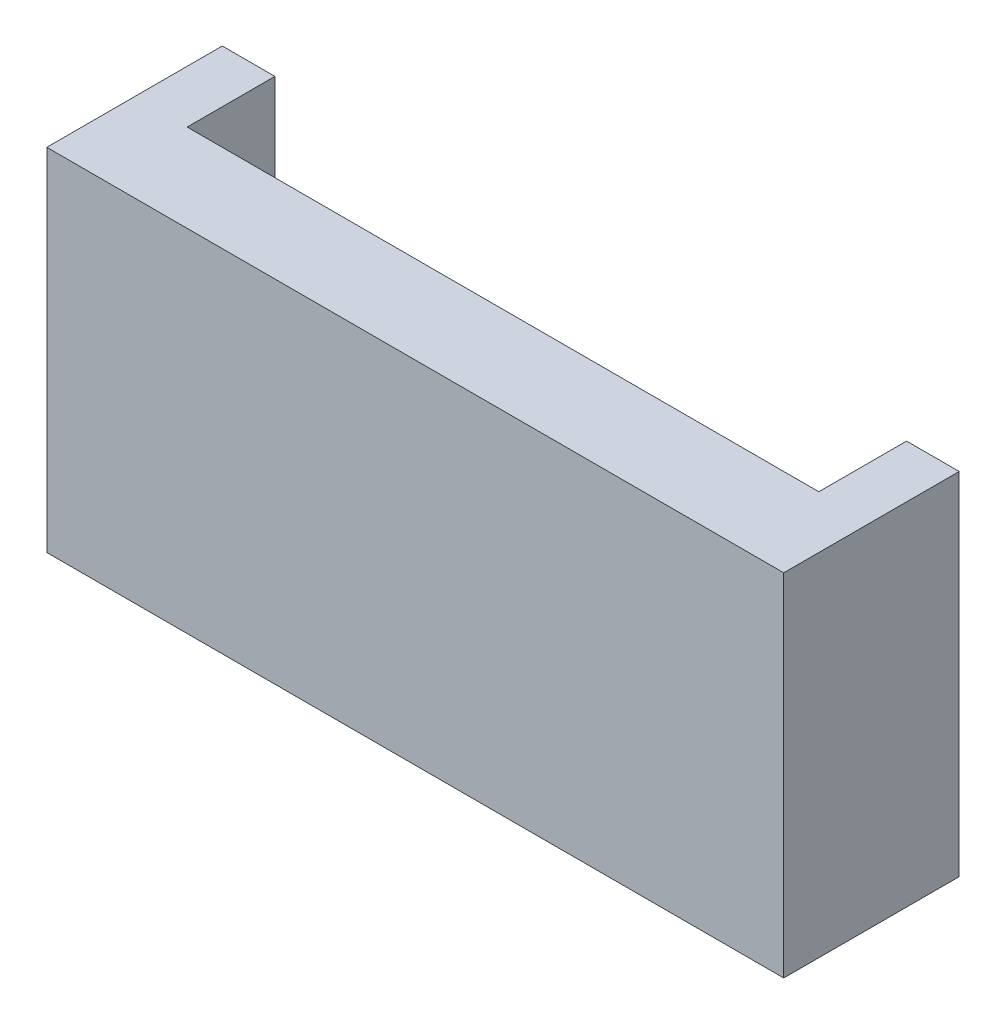
ISO-10303-21;
HEADER;
FILE_DESCRIPTION(('STEP AP214'),'2;1');
FILE_NAME('part.step','',(''),(''),'','','');
FILE_SCHEMA(('AUTOMOTIVE_DESIGN { 1 0 10303 214 1 1 1 1 }'));
ENDSEC;
DATA;
#1=APPLICATION_CONTEXT('core data for automotive mechanical design processes');
#2=APPLICATION_PROTOCOL_DEFINITION('international standard','automotive_design',2000,#1);
#3=PRODUCT_CONTEXT('',#1,'mechanical');
#4=PRODUCT('Part','Part','',(#3));
#5=PRODUCT_RELATED_PRODUCT_CATEGORY('part','',(#4));
#6=PRODUCT_DEFINITION_FORMATION('','',#4);
#7=PRODUCT_DEFINITION_CONTEXT('part definition',#1,'design');
#8=PRODUCT_DEFINITION('design','',#6,#7);
#9=PRODUCT_DEFINITION_SHAPE('','',#8);
#10=(LENGTH_UNIT() NAMED_UNIT(*) SI_UNIT(.MILLI.,.METRE.));
#11=(NAMED_UNIT(*) PLANE_ANGLE_UNIT() SI_UNIT($,.RADIAN.));
#12=(NAMED_UNIT(*) SI_UNIT($,.STERADIAN.) SOLID_ANGLE_UNIT());
#13=UNCERTAINTY_MEASURE_WITH_UNIT(LENGTH_MEASURE(1.E-05),#10,'distance_accuracy_value','');
#14=(GEOMETRIC_REPRESENTATION_CONTEXT(3) GLOBAL_UNCERTAINTY_ASSIGNED_CONTEXT((#13)) GLOBAL_UNIT_ASSIGNED_CONTEXT((#10,
#11,#12)) REPRESENTATION_CONTEXT('',''));
#15=CARTESIAN_POINT('',(0.,0.,0.));
#16=DIRECTION('',(0.,0.,1.));
#17=DIRECTION('',(1.,0.,0.));
#18=AXIS2_PLACEMENT_3D('',#15,#16,#17);
#19=CARTESIAN_POINT('',(0.,1.5,0.));
#20=DIRECTION('',(0.,1.,0.));
#21=DIRECTION('',(0.,0.,1.));
#22=AXIS2_PLACEMENT_3D('',#19,#20,#21);
#23=PLANE('',#22);
#24=DIRECTION('',(1.,0.,0.));
#25=VECTOR('',#24,1.);
#26=CARTESIAN_POINT('',(12.1517857142857,1.5,-1.61160714285714));
#27=LINE('',#26,#25);
#28=CARTESIAN_POINT('',(7.35178571428571,1.5,-1.61160714285714));
#29=VERTEX_POINT('',#28);
#30=CARTESIAN_POINT('',(12.1517857142857,1.5,-1.61160714285714));
#31=VERTEX_POINT('',#30);
#32=EDGE_CURVE('E57',#29,#31,#27,.T.);
#33=ORIENTED_EDGE('',*,*,#32,.F.);
#34=DIRECTION('',(0.,0.,1.));
#35=VECTOR('',#34,1.);
#36=CARTESIAN_POINT('',(7.35178571428571,1.5,-1.61160714285714));
#37=LINE('',#36,#35);
#38=CARTESIAN_POINT('',(7.35178571428571,1.5,-2.61160714285714));
#39=VERTEX_POINT('',#38);
#40=EDGE_CURVE('E152',#39,#29,#37,.T.);
#41=ORIENTED_EDGE('',*,*,#40,.F.);
#42=DIRECTION('',(-1.,0.,0.));
#43=VECTOR('',#42,1.);
#44=CARTESIAN_POINT('',(-5.84821428571429,1.5,-2.61160714285714));
#45=LINE('',#44,#43);
#46=CARTESIAN_POINT('',(-1.04821428571429,1.5,-2.61160714285714));
#47=VERTEX_POINT('',#46);
#48=EDGE_CURVE('E11',#39,#47,#45,.T.);
#49=ORIENTED_EDGE('',*,*,#48,.T.);
#50=DIRECTION('',(0.,0.,-1.));
#51=VECTOR('',#50,1.);
#52=CARTESIAN_POINT('',(-1.04821428571429,1.5,-1.61160714285714));
#53=LINE('',#52,#51);
#54=CARTESIAN_POINT('',(-1.04821428571429,1.5,-1.61160714285714));
#55=VERTEX_POINT('',#54);
#56=EDGE_CURVE('E251',#55,#47,#53,.T.);
#57=ORIENTED_EDGE('',*,*,#56,.F.);
#58=DIRECTION('',(1.,0.,0.));
#59=VECTOR('',#58,1.);
#60=CARTESIAN_POINT('',(-5.84821428571429,1.5,-1.61160714285714));
#61=LINE('',#60,#59);
#62=CARTESIAN_POINT('',(-5.84821428571429,1.5,-1.61160714285714));
#63=VERTEX_POINT('',#62);
#64=EDGE_CURVE('E257',#63,#55,#61,.T.);
#65=ORIENTED_EDGE('',*,*,#64,.F.);
#66=DIRECTION('',(0.,0.,1.));
#67=VECTOR('',#66,1.);
#68=CARTESIAN_POINT('',(-5.84821428571429,1.5,-2.61160714285714));
#69=LINE('',#68,#67);
#70=CARTESIAN_POINT('',(-5.84821428571429,1.5,-0.111607142857142));
#71=VERTEX_POINT('',#70);
#72=EDGE_CURVE('E287',#63,#71,#69,.T.);
#73=ORIENTED_EDGE('',*,*,#72,.T.);
#74=DIRECTION('',(-1.,0.,0.));
#75=VECTOR('',#74,1.);
#76=CARTESIAN_POINT('',(-5.84821428571429,1.5,-0.111607142857142));
#77=LINE('',#76,#75);
#78=CARTESIAN_POINT('',(12.1517857142857,1.5,-0.111607142857142));
#79=VERTEX_POINT('',#78);
#80=EDGE_CURVE('E241',#79,#71,#77,.T.);
#81=ORIENTED_EDGE('',*,*,#80,.F.);
#82=DIRECTION('',(0.,0.,-1.));
#83=VECTOR('',#82,1.);
#84=CARTESIAN_POINT('',(12.1517857142857,1.5,-2.61160714285714));
#85=LINE('',#84,#83);
#86=EDGE_CURVE('E49',#79,#31,#85,.T.);
#87=ORIENTED_EDGE('',*,*,#86,.T.);
#88=EDGE_LOOP('',(#33,#41,#49,#57,#65,#73,#81,#87));
#89=FACE_BOUND('',#88,.T.);
#90=ADVANCED_FACE('F39',(#89),#23,.T.);
#91=CARTESIAN_POINT('',(-5.84821428571429,1.5,2.38839285714286));
#92=DIRECTION('',(0.,0.,-1.));
#93=DIRECTION('',(-1.,0.,0.));
#94=AXIS2_PLACEMENT_3D('',#91,#92,#93);
#95=PLANE('',#94);
#96=DIRECTION('',(1.,0.,0.));
#97=VECTOR('',#96,1.);
#98=CARTESIAN_POINT('',(-5.84821428571429,0.,2.38839285714286));
#99=LINE('',#98,#97);
#100=CARTESIAN_POINT('',(-7.34821428571429,0.,2.38839285714286));
#101=VERTEX_POINT('',#100);
#102=CARTESIAN_POINT('',(13.6517857142857,0.,2.38839285714286));
#103=VERTEX_POINT('',#102);
#104=EDGE_CURVE('E286',#101,#103,#99,.T.);
#105=ORIENTED_EDGE('',*,*,#104,.T.);
#106=DIRECTION('',(0.,-1.,0.));
#107=VECTOR('',#106,1.);
#108=CARTESIAN_POINT('',(13.6517857142857,0.,2.38839285714286));
#109=LINE('',#108,#107);
#110=CARTESIAN_POINT('',(13.6517857142857,10.,2.38839285714286));
#111=VERTEX_POINT('',#110);
#112=EDGE_CURVE('E147',#111,#103,#109,.T.);
#113=ORIENTED_EDGE('',*,*,#112,.F.);
#114=DIRECTION('',(1.,0.,0.));
#115=VECTOR('',#114,1.);
#116=CARTESIAN_POINT('',(12.1517857142857,10.,2.38839285714286));
#117=LINE('',#116,#115);
#118=CARTESIAN_POINT('',(-7.34821428571429,10.,2.38839285714286));
#119=VERTEX_POINT('',#118);
#120=EDGE_CURVE('E142',#119,#111,#117,.T.);
#121=ORIENTED_EDGE('',*,*,#120,.F.);
#122=DIRECTION('',(0.,1.,0.));
#123=VECTOR('',#122,1.);
#124=CARTESIAN_POINT('',(-7.34821428571429,0.,2.38839285714286));
#125=LINE('',#124,#123);
#126=EDGE_CURVE('E145',#101,#119,#125,.T.);
#127=ORIENTED_EDGE('',*,*,#126,.F.);
#128=EDGE_LOOP('',(#105,#113,#121,#127));
#129=FACE_BOUND('',#128,.T.);
#130=ADVANCED_FACE('F41',(#129),#95,.F.);
#131=CARTESIAN_POINT('',(-5.84821428571429,1.5,-2.61160714285714));
#132=DIRECTION('',(0.,0.,1.));
#133=DIRECTION('',(1.,0.,0.));
#134=AXIS2_PLACEMENT_3D('',#131,#132,#133);
#135=PLANE('',#134);
#136=DIRECTION('',(-1.,0.,0.));
#137=VECTOR('',#136,1.);
#138=CARTESIAN_POINT('',(-5.84821428571429,0.,-2.61160714285714));
#139=LINE('',#138,#137);
#140=CARTESIAN_POINT('',(13.6517857142857,0.,-2.61160714285714));
#141=VERTEX_POINT('',#140);
#142=CARTESIAN_POINT('',(-7.34821428571429,0.,-2.61160714285714));
#143=VERTEX_POINT('',#142);
#144=EDGE_CURVE('E43',#141,#143,#139,.T.);
#145=ORIENTED_EDGE('',*,*,#144,.T.);
#146=DIRECTION('',(0.,-1.,0.));
#147=VECTOR('',#146,1.);
#148=CARTESIAN_POINT('',(-7.34821428571429,0.,-2.61160714285714));
#149=LINE('',#148,#147);
#150=CARTESIAN_POINT('',(-7.34821428571429,10.,-2.61160714285714));
#151=VERTEX_POINT('',#150);
#152=EDGE_CURVE('E164',#151,#143,#149,.T.);
#153=ORIENTED_EDGE('',*,*,#152,.F.);
#154=DIRECTION('',(1.,0.,0.));
#155=VECTOR('',#154,1.);
#156=CARTESIAN_POINT('',(-7.34821428571429,10.,-2.61160714285714));
#157=LINE('',#156,#155);
#158=CARTESIAN_POINT('',(-5.84821428571429,10.,-2.61160714285714));
#159=VERTEX_POINT('',#158);
#160=EDGE_CURVE('E159',#151,#159,#157,.T.);
#161=ORIENTED_EDGE('',*,*,#160,.T.);
#162=DIRECTION('',(0.,-1.,0.));
#163=VECTOR('',#162,1.);
#164=CARTESIAN_POINT('',(-5.84821428571429,0.,-2.61160714285714));
#165=LINE('',#164,#163);
#166=CARTESIAN_POINT('',(-5.84821428571429,5.5,-2.61160714285714));
#167=VERTEX_POINT('',#166);
#168=EDGE_CURVE('E171',#159,#167,#165,.T.);
#169=ORIENTED_EDGE('',*,*,#168,.T.);
#170=DIRECTION('',(-1.,0.,0.));
#171=VECTOR('',#170,1.);
#172=CARTESIAN_POINT('',(-5.84821428571429,5.5,-2.61160714285714));
#173=LINE('',#172,#171);
#174=CARTESIAN_POINT('',(-1.04821428571429,5.5,-2.61160714285714));
#175=VERTEX_POINT('',#174);
#176=EDGE_CURVE('E256',#175,#167,#173,.T.);
#177=ORIENTED_EDGE('',*,*,#176,.F.);
#178=DIRECTION('',(0.,-1.,0.));
#179=VECTOR('',#178,1.);
#180=CARTESIAN_POINT('',(-1.04821428571429,5.5,-2.61160714285714));
#181=LINE('',#180,#179);
#182=EDGE_CURVE('E282',#175,#47,#181,.T.);
#183=ORIENTED_EDGE('',*,*,#182,.T.);
#184=ORIENTED_EDGE('',*,*,#48,.F.);
#185=DIRECTION('',(0.,-1.,0.));
#186=VECTOR('',#185,1.);
#187=CARTESIAN_POINT('',(7.35178571428571,5.5,-2.61160714285714));
#188=LINE('',#187,#186);
#189=CARTESIAN_POINT('',(7.35178571428571,5.5,-2.61160714285714));
#190=VERTEX_POINT('',#189);
#191=EDGE_CURVE('E237',#190,#39,#188,.T.);
#192=ORIENTED_EDGE('',*,*,#191,.F.);
#193=DIRECTION('',(-1.,0.,0.));
#194=VECTOR('',#193,1.);
#195=CARTESIAN_POINT('',(12.1517857142857,5.5,-2.61160714285714));
#196=LINE('',#195,#194);
#197=CARTESIAN_POINT('',(12.1517857142857,5.5,-2.61160714285714));
#198=VERTEX_POINT('',#197);
#199=EDGE_CURVE('E216',#198,#190,#196,.T.);
#200=ORIENTED_EDGE('',*,*,#199,.F.);
#201=DIRECTION('',(0.,1.,0.));
#202=VECTOR('',#201,1.);
#203=CARTESIAN_POINT('',(12.1517857142857,0.,-2.61160714285714));
#204=LINE('',#203,#202);
#205=CARTESIAN_POINT('',(12.1517857142857,10.,-2.61160714285714));
#206=VERTEX_POINT('',#205);
#207=EDGE_CURVE('E186',#198,#206,#204,.T.);
#208=ORIENTED_EDGE('',*,*,#207,.T.);
#209=DIRECTION('',(-1.,0.,0.));
#210=VECTOR('',#209,1.);
#211=CARTESIAN_POINT('',(13.6517857142857,10.,-2.61160714285714));
#212=LINE('',#211,#210);
#213=CARTESIAN_POINT('',(13.6517857142857,10.,-2.61160714285714));
#214=VERTEX_POINT('',#213);
#215=EDGE_CURVE('E200',#214,#206,#212,.T.);
#216=ORIENTED_EDGE('',*,*,#215,.F.);
#217=DIRECTION('',(0.,1.,0.));
#218=VECTOR('',#217,1.);
#219=CARTESIAN_POINT('',(13.6517857142857,0.,-2.61160714285714));
#220=LINE('',#219,#218);
#221=EDGE_CURVE('E194',#141,#214,#220,.T.);
#222=ORIENTED_EDGE('',*,*,#221,.F.);
#223=EDGE_LOOP('',(#145,#153,#161,#169,#177,#183,#184,#192,#200,#208,#216,#222));
#224=FACE_BOUND('',#223,.T.);
#225=ADVANCED_FACE('F297',(#224),#135,.F.);
#226=CARTESIAN_POINT('',(0.,0.,0.));
#227=DIRECTION('',(0.,1.,0.));
#228=DIRECTION('',(0.,0.,1.));
#229=AXIS2_PLACEMENT_3D('',#226,#227,#228);
#230=PLANE('',#229);
#231=ORIENTED_EDGE('',*,*,#104,.F.);
#232=DIRECTION('',(0.,0.,1.));
#233=VECTOR('',#232,1.);
#234=CARTESIAN_POINT('',(-7.34821428571429,0.,2.38839285714286));
#235=LINE('',#234,#233);
#236=EDGE_CURVE('E169',#143,#101,#235,.T.);
#237=ORIENTED_EDGE('',*,*,#236,.F.);
#238=ORIENTED_EDGE('',*,*,#144,.F.);
#239=DIRECTION('',(0.,0.,-1.));
#240=VECTOR('',#239,1.);
#241=CARTESIAN_POINT('',(13.6517857142857,0.,2.38839285714286));
#242=LINE('',#241,#240);
#243=EDGE_CURVE('E189',#103,#141,#242,.T.);
#244=ORIENTED_EDGE('',*,*,#243,.F.);
#245=EDGE_LOOP('',(#231,#237,#238,#244));
#246=FACE_BOUND('',#245,.T.);
#247=ADVANCED_FACE('F300',(#246),#230,.F.);
#248=CARTESIAN_POINT('',(-1.04821428571429,5.5,-1.61160714285714));
#249=DIRECTION('',(-1.,0.,0.));
#250=DIRECTION('',(0.,0.,1.));
#251=AXIS2_PLACEMENT_3D('',#248,#249,#250);
#252=PLANE('',#251);
#253=ORIENTED_EDGE('',*,*,#56,.T.);
#254=ORIENTED_EDGE('',*,*,#182,.F.);
#255=DIRECTION('',(0.,0.,-1.));
#256=VECTOR('',#255,1.);
#257=CARTESIAN_POINT('',(-1.04821428571429,5.5,-1.61160714285714));
#258=LINE('',#257,#256);
#259=CARTESIAN_POINT('',(-1.04821428571429,5.5,-1.61160714285714));
#260=VERTEX_POINT('',#259);
#261=EDGE_CURVE('E252',#260,#175,#258,.T.);
#262=ORIENTED_EDGE('',*,*,#261,.F.);
#263=DIRECTION('',(0.,-1.,0.));
#264=VECTOR('',#263,1.);
#265=CARTESIAN_POINT('',(-1.04821428571429,5.5,-1.61160714285714));
#266=LINE('',#265,#264);
#267=EDGE_CURVE('E268',#260,#55,#266,.T.);
#268=ORIENTED_EDGE('',*,*,#267,.T.);
#269=EDGE_LOOP('',(#253,#254,#262,#268));
#270=FACE_BOUND('',#269,.T.);
#271=ADVANCED_FACE('F324',(#270),#252,.F.);
#272=CARTESIAN_POINT('',(-5.84821428571429,5.5,-1.61160714285714));
#273=DIRECTION('',(0.,0.,-1.));
#274=DIRECTION('',(-1.,0.,0.));
#275=AXIS2_PLACEMENT_3D('',#272,#273,#274);
#276=PLANE('',#275);
#277=ORIENTED_EDGE('',*,*,#64,.T.);
#278=ORIENTED_EDGE('',*,*,#267,.F.);
#279=DIRECTION('',(1.,0.,0.));
#280=VECTOR('',#279,1.);
#281=CARTESIAN_POINT('',(-5.84821428571429,5.5,-1.61160714285714));
#282=LINE('',#281,#280);
#283=CARTESIAN_POINT('',(-5.84821428571429,5.5,-1.61160714285714));
#284=VERTEX_POINT('',#283);
#285=EDGE_CURVE('E265',#284,#260,#282,.T.);
#286=ORIENTED_EDGE('',*,*,#285,.F.);
#287=DIRECTION('',(0.,-1.,0.));
#288=VECTOR('',#287,1.);
#289=CARTESIAN_POINT('',(-5.84821428571429,5.5,-1.61160714285714));
#290=LINE('',#289,#288);
#291=EDGE_CURVE('E278',#284,#63,#290,.T.);
#292=ORIENTED_EDGE('',*,*,#291,.T.);
#293=EDGE_LOOP('',(#277,#278,#286,#292));
#294=FACE_BOUND('',#293,.T.);
#295=ADVANCED_FACE('F320',(#294),#276,.F.);
#296=CARTESIAN_POINT('',(0.,5.5,0.));
#297=DIRECTION('',(0.,-1.,0.));
#298=DIRECTION('',(0.,0.,-1.));
#299=AXIS2_PLACEMENT_3D('',#296,#297,#298);
#300=PLANE('',#299);
#301=ORIENTED_EDGE('',*,*,#261,.T.);
#302=ORIENTED_EDGE('',*,*,#176,.T.);
#303=DIRECTION('',(0.,0.,1.));
#304=VECTOR('',#303,1.);
#305=CARTESIAN_POINT('',(-5.84821428571429,5.5,-1.61160714285714));
#306=LINE('',#305,#304);
#307=EDGE_CURVE('E261',#167,#284,#306,.T.);
#308=ORIENTED_EDGE('',*,*,#307,.T.);
#309=ORIENTED_EDGE('',*,*,#285,.T.);
#310=EDGE_LOOP('',(#301,#302,#308,#309));
#311=FACE_BOUND('',#310,.T.);
#312=ADVANCED_FACE('F317',(#311),#300,.F.);
#313=CARTESIAN_POINT('',(-5.84821428571429,5.5,-0.111607142857142));
#314=DIRECTION('',(0.,0.,1.));
#315=DIRECTION('',(1.,0.,0.));
#316=AXIS2_PLACEMENT_3D('',#313,#314,#315);
#317=PLANE('',#316);
#318=ORIENTED_EDGE('',*,*,#80,.T.);
#319=DIRECTION('',(0.,-1.,0.));
#320=VECTOR('',#319,1.);
#321=CARTESIAN_POINT('',(-5.84821428571429,5.5,-0.111607142857142));
#322=LINE('',#321,#320);
#323=CARTESIAN_POINT('',(-5.84821428571429,10.,-0.111607142857142));
#324=VERTEX_POINT('',#323);
#325=EDGE_CURVE('E245',#324,#71,#322,.T.);
#326=ORIENTED_EDGE('',*,*,#325,.F.);
#327=DIRECTION('',(-1.,0.,0.));
#328=VECTOR('',#327,1.);
#329=CARTESIAN_POINT('',(12.1517857142857,10.,-0.111607142857142));
#330=LINE('',#329,#328);
#331=CARTESIAN_POINT('',(12.1517857142857,10.,-0.111607142857142));
#332=VERTEX_POINT('',#331);
#333=EDGE_CURVE('E153',#332,#324,#330,.T.);
#334=ORIENTED_EDGE('',*,*,#333,.F.);
#335=DIRECTION('',(0.,-1.,0.));
#336=VECTOR('',#335,1.);
#337=CARTESIAN_POINT('',(12.1517857142857,5.5,-0.111607142857142));
#338=LINE('',#337,#336);
#339=EDGE_CURVE('E248',#332,#79,#338,.T.);
#340=ORIENTED_EDGE('',*,*,#339,.T.);
#341=EDGE_LOOP('',(#318,#326,#334,#340));
#342=FACE_BOUND('',#341,.T.);
#343=ADVANCED_FACE('F309',(#342),#317,.F.);
#344=CARTESIAN_POINT('',(7.35178571428571,5.5,-1.61160714285714));
#345=DIRECTION('',(1.,0.,0.));
#346=DIRECTION('',(0.,0.,-1.));
#347=AXIS2_PLACEMENT_3D('',#344,#345,#346);
#348=PLANE('',#347);
#349=ORIENTED_EDGE('',*,*,#40,.T.);
#350=DIRECTION('',(0.,-1.,0.));
#351=VECTOR('',#350,1.);
#352=CARTESIAN_POINT('',(7.35178571428571,5.5,-1.61160714285714));
#353=LINE('',#352,#351);
#354=CARTESIAN_POINT('',(7.35178571428571,5.5,-1.61160714285714));
#355=VERTEX_POINT('',#354);
#356=EDGE_CURVE('E233',#355,#29,#353,.T.);
#357=ORIENTED_EDGE('',*,*,#356,.F.);
#358=DIRECTION('',(0.,0.,1.));
#359=VECTOR('',#358,1.);
#360=CARTESIAN_POINT('',(7.35178571428571,5.5,-1.61160714285714));
#361=LINE('',#360,#359);
#362=EDGE_CURVE('E219',#190,#355,#361,.T.);
#363=ORIENTED_EDGE('',*,*,#362,.F.);
#364=ORIENTED_EDGE('',*,*,#191,.T.);
#365=EDGE_LOOP('',(#349,#357,#363,#364));
#366=FACE_BOUND('',#365,.T.);
#367=ADVANCED_FACE('F329',(#366),#348,.F.);
#368=CARTESIAN_POINT('',(12.1517857142857,5.5,-1.61160714285714));
#369=DIRECTION('',(0.,0.,-1.));
#370=DIRECTION('',(-1.,0.,0.));
#371=AXIS2_PLACEMENT_3D('',#368,#369,#370);
#372=PLANE('',#371);
#373=ORIENTED_EDGE('',*,*,#32,.T.);
#374=DIRECTION('',(0.,-1.,0.));
#375=VECTOR('',#374,1.);
#376=CARTESIAN_POINT('',(12.1517857142857,5.5,-1.61160714285714));
#377=LINE('',#376,#375);
#378=CARTESIAN_POINT('',(12.1517857142857,5.5,-1.61160714285714));
#379=VERTEX_POINT('',#378);
#380=EDGE_CURVE('E226',#379,#31,#377,.T.);
#381=ORIENTED_EDGE('',*,*,#380,.F.);
#382=DIRECTION('',(1.,0.,0.));
#383=VECTOR('',#382,1.);
#384=CARTESIAN_POINT('',(12.1517857142857,5.5,-1.61160714285714));
#385=LINE('',#384,#383);
#386=EDGE_CURVE('E222',#355,#379,#385,.T.);
#387=ORIENTED_EDGE('',*,*,#386,.F.);
#388=ORIENTED_EDGE('',*,*,#356,.T.);
#389=EDGE_LOOP('',(#373,#381,#387,#388));
#390=FACE_BOUND('',#389,.T.);
#391=ADVANCED_FACE('F335',(#390),#372,.F.);
#392=CARTESIAN_POINT('',(0.,5.5,0.));
#393=DIRECTION('',(0.,1.,0.));
#394=DIRECTION('',(0.,0.,1.));
#395=AXIS2_PLACEMENT_3D('',#392,#393,#394);
#396=PLANE('',#395);
#397=DIRECTION('',(0.,0.,-1.));
#398=VECTOR('',#397,1.);
#399=CARTESIAN_POINT('',(12.1517857142857,5.5,-1.61160714285714));
#400=LINE('',#399,#398);
#401=EDGE_CURVE('E212',#379,#198,#400,.T.);
#402=ORIENTED_EDGE('',*,*,#401,.T.);
#403=ORIENTED_EDGE('',*,*,#199,.T.);
#404=ORIENTED_EDGE('',*,*,#362,.T.);
#405=ORIENTED_EDGE('',*,*,#386,.T.);
#406=EDGE_LOOP('',(#402,#403,#404,#405));
#407=FACE_BOUND('',#406,.T.);
#408=ADVANCED_FACE('F332',(#407),#396,.T.);
#409=CARTESIAN_POINT('',(0.,10.,0.));
#410=DIRECTION('',(0.,1.,0.));
#411=DIRECTION('',(0.,0.,1.));
#412=AXIS2_PLACEMENT_3D('',#409,#410,#411);
#413=PLANE('',#412);
#414=ORIENTED_EDGE('',*,*,#120,.T.);
#415=DIRECTION('',(0.,0.,1.));
#416=VECTOR('',#415,1.);
#417=CARTESIAN_POINT('',(13.6517857142857,10.,2.38839285714286));
#418=LINE('',#417,#416);
#419=EDGE_CURVE('E197',#214,#111,#418,.T.);
#420=ORIENTED_EDGE('',*,*,#419,.F.);
#421=ORIENTED_EDGE('',*,*,#215,.T.);
#422=DIRECTION('',(0.,0.,1.));
#423=VECTOR('',#422,1.);
#424=CARTESIAN_POINT('',(12.1517857142857,10.,2.38839285714286));
#425=LINE('',#424,#423);
#426=EDGE_CURVE('E190',#206,#332,#425,.T.);
#427=ORIENTED_EDGE('',*,*,#426,.T.);
#428=ORIENTED_EDGE('',*,*,#333,.T.);
#429=DIRECTION('',(0.,0.,-1.));
#430=VECTOR('',#429,1.);
#431=CARTESIAN_POINT('',(-5.84821428571429,10.,2.38839285714286));
#432=LINE('',#431,#430);
#433=EDGE_CURVE('E175',#324,#159,#432,.T.);
#434=ORIENTED_EDGE('',*,*,#433,.T.);
#435=ORIENTED_EDGE('',*,*,#160,.F.);
#436=DIRECTION('',(0.,0.,-1.));
#437=VECTOR('',#436,1.);
#438=CARTESIAN_POINT('',(-7.34821428571429,10.,2.38839285714286));
#439=LINE('',#438,#437);
#440=EDGE_CURVE('E156',#119,#151,#439,.T.);
#441=ORIENTED_EDGE('',*,*,#440,.F.);
#442=EDGE_LOOP('',(#414,#420,#421,#427,#428,#434,#435,#441));
#443=FACE_BOUND('',#442,.T.);
#444=ADVANCED_FACE('F157',(#443),#413,.T.);
#445=CARTESIAN_POINT('',(12.1517857142857,0.,0.));
#446=DIRECTION('',(-1.,0.,0.));
#447=DIRECTION('',(0.,0.,1.));
#448=AXIS2_PLACEMENT_3D('',#445,#446,#447);
#449=PLANE('',#448);
#450=ORIENTED_EDGE('',*,*,#401,.F.);
#451=ORIENTED_EDGE('',*,*,#380,.T.);
#452=ORIENTED_EDGE('',*,*,#86,.F.);
#453=ORIENTED_EDGE('',*,*,#339,.F.);
#454=ORIENTED_EDGE('',*,*,#426,.F.);
#455=ORIENTED_EDGE('',*,*,#207,.F.);
#456=EDGE_LOOP('',(#450,#451,#452,#453,#454,#455));
#457=FACE_BOUND('',#456,.T.);
#458=ADVANCED_FACE('F305',(#457),#449,.T.);
#459=CARTESIAN_POINT('',(13.6517857142857,0.,0.));
#460=DIRECTION('',(-1.,0.,0.));
#461=DIRECTION('',(0.,0.,1.));
#462=AXIS2_PLACEMENT_3D('',#459,#460,#461);
#463=PLANE('',#462);
#464=ORIENTED_EDGE('',*,*,#112,.T.);
#465=ORIENTED_EDGE('',*,*,#243,.T.);
#466=ORIENTED_EDGE('',*,*,#221,.T.);
#467=ORIENTED_EDGE('',*,*,#419,.T.);
#468=EDGE_LOOP('',(#464,#465,#466,#467));
#469=FACE_BOUND('',#468,.T.);
#470=ADVANCED_FACE('F302',(#469),#463,.F.);
#471=CARTESIAN_POINT('',(-5.84821428571429,0.,0.));
#472=DIRECTION('',(-1.,0.,0.));
#473=DIRECTION('',(0.,0.,1.));
#474=AXIS2_PLACEMENT_3D('',#471,#472,#473);
#475=PLANE('',#474);
#476=ORIENTED_EDGE('',*,*,#433,.F.);
#477=ORIENTED_EDGE('',*,*,#325,.T.);
#478=ORIENTED_EDGE('',*,*,#72,.F.);
#479=ORIENTED_EDGE('',*,*,#291,.F.);
#480=ORIENTED_EDGE('',*,*,#307,.F.);
#481=ORIENTED_EDGE('',*,*,#168,.F.);
#482=EDGE_LOOP('',(#476,#477,#478,#479,#480,#481));
#483=FACE_BOUND('',#482,.T.);
#484=ADVANCED_FACE('F313',(#483),#475,.F.);
#485=CARTESIAN_POINT('',(-7.34821428571429,0.,0.));
#486=DIRECTION('',(-1.,0.,0.));
#487=DIRECTION('',(0.,0.,1.));
#488=AXIS2_PLACEMENT_3D('',#485,#486,#487);
#489=PLANE('',#488);
#490=ORIENTED_EDGE('',*,*,#126,.T.);
#491=ORIENTED_EDGE('',*,*,#440,.T.);
#492=ORIENTED_EDGE('',*,*,#152,.T.);
#493=ORIENTED_EDGE('',*,*,#236,.T.);
#494=EDGE_LOOP('',(#490,#491,#492,#493));
#495=FACE_BOUND('',#494,.T.);
#496=ADVANCED_FACE('F167',(#495),#489,.T.);
#497=CLOSED_SHELL('',(#90,#130,#225,#247,#271,#295,#312,#343,#367,#391,#408,#444,#458,#470,#484,#496));
#498=MANIFOLD_SOLID_BREP('B2',#497);
#499=ADVANCED_BREP_SHAPE_REPRESENTATION('',(#18,#498),#14);
#500=SHAPE_DEFINITION_REPRESENTATION(#9,#499);
ENDSEC;
END-ISO-10303-21;
